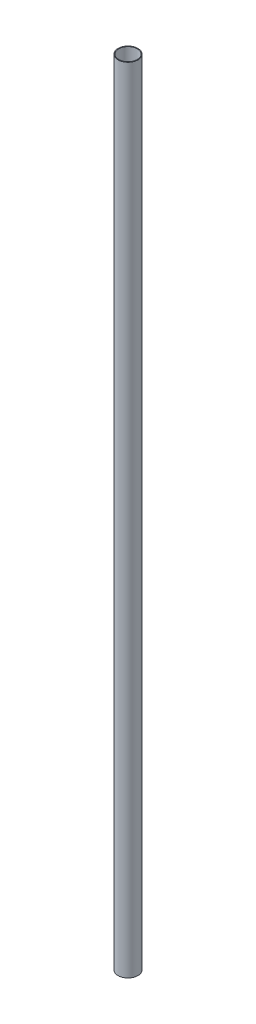
ISO-10303-21;
HEADER;
FILE_DESCRIPTION(('STEP AP214'),'2;1');
FILE_NAME('part.step','',(''),(''),'','','');
FILE_SCHEMA(('AUTOMOTIVE_DESIGN { 1 0 10303 214 1 1 1 1 }'));
ENDSEC;
DATA;
#1=APPLICATION_CONTEXT('core data for automotive mechanical design processes');
#2=APPLICATION_PROTOCOL_DEFINITION('international standard','automotive_design',2000,#1);
#3=PRODUCT_CONTEXT('',#1,'mechanical');
#4=PRODUCT('Part','Part','',(#3));
#5=PRODUCT_RELATED_PRODUCT_CATEGORY('part','',(#4));
#6=PRODUCT_DEFINITION_FORMATION('','',#4);
#7=PRODUCT_DEFINITION_CONTEXT('part definition',#1,'design');
#8=PRODUCT_DEFINITION('design','',#6,#7);
#9=PRODUCT_DEFINITION_SHAPE('','',#8);
#10=(LENGTH_UNIT() NAMED_UNIT(*) SI_UNIT(.MILLI.,.METRE.));
#11=(NAMED_UNIT(*) PLANE_ANGLE_UNIT() SI_UNIT($,.RADIAN.));
#12=(NAMED_UNIT(*) SI_UNIT($,.STERADIAN.) SOLID_ANGLE_UNIT());
#13=UNCERTAINTY_MEASURE_WITH_UNIT(LENGTH_MEASURE(1.E-05),#10,'distance_accuracy_value','');
#14=(GEOMETRIC_REPRESENTATION_CONTEXT(3) GLOBAL_UNCERTAINTY_ASSIGNED_CONTEXT((#13)) GLOBAL_UNIT_ASSIGNED_CONTEXT((#10,
#11,#12)) REPRESENTATION_CONTEXT('',''));
#15=CARTESIAN_POINT('',(0.,0.,0.));
#16=DIRECTION('',(0.,0.,1.));
#17=DIRECTION('',(1.,0.,0.));
#18=AXIS2_PLACEMENT_3D('',#15,#16,#17);
#19=CARTESIAN_POINT('',(0.,278.,0.));
#20=DIRECTION('',(0.,1.,0.));
#21=DIRECTION('',(0.,0.,1.));
#22=AXIS2_PLACEMENT_3D('',#19,#20,#21);
#23=PLANE('',#22);
#24=CARTESIAN_POINT('',(0.,278.,0.));
#25=DIRECTION('',(0.,1.,0.));
#26=DIRECTION('',(0.,0.,1.));
#27=AXIS2_PLACEMENT_3D('',#24,#25,#26);
#28=CIRCLE('',#27,3.5);
#29=CARTESIAN_POINT('',(0.,278.,3.5));
#30=VERTEX_POINT('',#29);
#31=EDGE_CURVE('E10',#30,#30,#28,.T.);
#32=ORIENTED_EDGE('',*,*,#31,.T.);
#33=EDGE_LOOP('',(#32));
#34=FACE_BOUND('',#33,.T.);
#35=CARTESIAN_POINT('',(0.,278.,0.));
#36=DIRECTION('',(0.,1.,0.));
#37=DIRECTION('',(0.,0.,1.));
#38=AXIS2_PLACEMENT_3D('',#35,#36,#37);
#39=CIRCLE('',#38,3.25);
#40=CARTESIAN_POINT('',(0.,278.,3.25));
#41=VERTEX_POINT('',#40);
#42=EDGE_CURVE('E46',#41,#41,#39,.T.);
#43=ORIENTED_EDGE('',*,*,#42,.F.);
#44=EDGE_LOOP('',(#43));
#45=FACE_BOUND('',#44,.T.);
#46=ADVANCED_FACE('F35',(#34,#45),#23,.T.);
#47=CARTESIAN_POINT('',(0.,0.,0.));
#48=DIRECTION('',(0.,1.,0.));
#49=DIRECTION('',(0.,0.,1.));
#50=AXIS2_PLACEMENT_3D('',#47,#48,#49);
#51=PLANE('',#50);
#52=CARTESIAN_POINT('',(0.,0.,0.));
#53=DIRECTION('',(0.,1.,0.));
#54=DIRECTION('',(0.,0.,1.));
#55=AXIS2_PLACEMENT_3D('',#52,#53,#54);
#56=CIRCLE('',#55,3.5);
#57=CARTESIAN_POINT('',(0.,0.,3.5));
#58=VERTEX_POINT('',#57);
#59=EDGE_CURVE('E39',#58,#58,#56,.T.);
#60=ORIENTED_EDGE('',*,*,#59,.F.);
#61=EDGE_LOOP('',(#60));
#62=FACE_BOUND('',#61,.T.);
#63=CARTESIAN_POINT('',(0.,0.,0.));
#64=DIRECTION('',(0.,1.,0.));
#65=DIRECTION('',(0.,0.,1.));
#66=AXIS2_PLACEMENT_3D('',#63,#64,#65);
#67=CIRCLE('',#66,3.25);
#68=CARTESIAN_POINT('',(0.,0.,3.25));
#69=VERTEX_POINT('',#68);
#70=EDGE_CURVE('E48',#69,#69,#67,.T.);
#71=ORIENTED_EDGE('',*,*,#70,.T.);
#72=EDGE_LOOP('',(#71));
#73=FACE_BOUND('',#72,.T.);
#74=ADVANCED_FACE('F58',(#62,#73),#51,.F.);
#75=CARTESIAN_POINT('',(0.,278.,0.));
#76=DIRECTION('',(0.,-1.,0.));
#77=DIRECTION('',(0.,0.,-1.));
#78=AXIS2_PLACEMENT_3D('',#75,#76,#77);
#79=CYLINDRICAL_SURFACE('',#78,3.5);
#80=ORIENTED_EDGE('',*,*,#31,.F.);
#81=EDGE_LOOP('',(#80));
#82=FACE_BOUND('',#81,.T.);
#83=ORIENTED_EDGE('',*,*,#59,.T.);
#84=EDGE_LOOP('',(#83));
#85=FACE_BOUND('',#84,.T.);
#86=ADVANCED_FACE('F37',(#82,#85),#79,.T.);
#87=CARTESIAN_POINT('',(0.,278.,0.));
#88=DIRECTION('',(0.,-1.,0.));
#89=DIRECTION('',(0.,0.,-1.));
#90=AXIS2_PLACEMENT_3D('',#87,#88,#89);
#91=CYLINDRICAL_SURFACE('',#90,3.25);
#92=ORIENTED_EDGE('',*,*,#42,.T.);
#93=EDGE_LOOP('',(#92));
#94=FACE_BOUND('',#93,.T.);
#95=ORIENTED_EDGE('',*,*,#70,.F.);
#96=EDGE_LOOP('',(#95));
#97=FACE_BOUND('',#96,.T.);
#98=ADVANCED_FACE('F54',(#94,#97),#91,.F.);
#99=CLOSED_SHELL('',(#46,#74,#86,#98));
#100=MANIFOLD_SOLID_BREP('B2',#99);
#101=ADVANCED_BREP_SHAPE_REPRESENTATION('',(#18,#100),#14);
#102=SHAPE_DEFINITION_REPRESENTATION(#9,#101);
ENDSEC;
END-ISO-10303-21;
